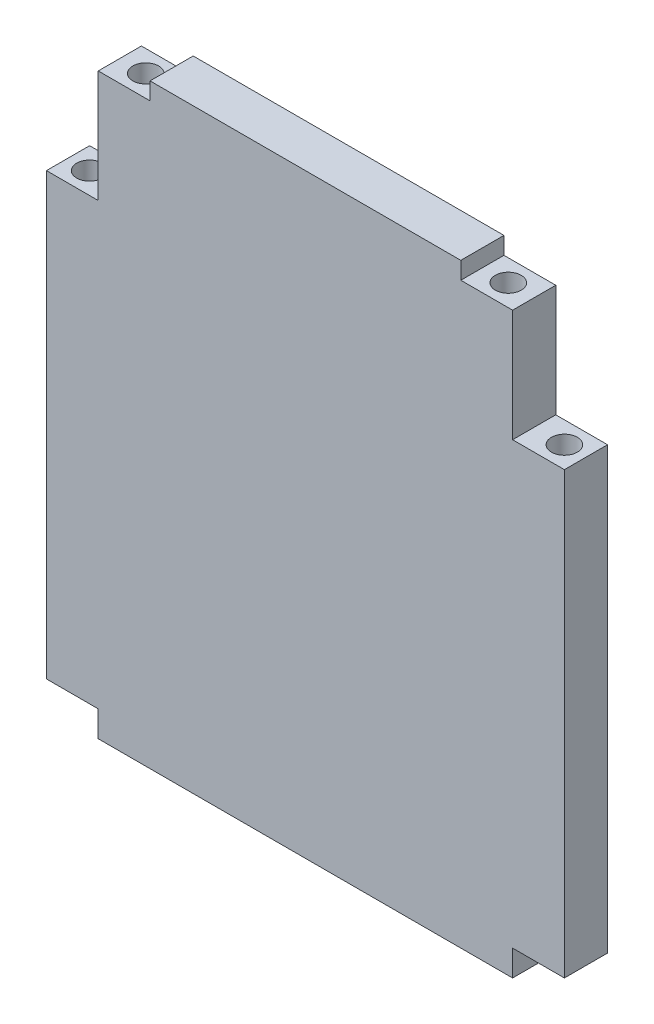
ISO-10303-21;
HEADER;
FILE_DESCRIPTION(('STEP AP214'),'2;1');
FILE_NAME('part.step','',(''),(''),'','','');
FILE_SCHEMA(('AUTOMOTIVE_DESIGN { 1 0 10303 214 1 1 1 1 }'));
ENDSEC;
DATA;
#1=APPLICATION_CONTEXT('core data for automotive mechanical design processes');
#2=APPLICATION_PROTOCOL_DEFINITION('international standard','automotive_design',2000,#1);
#3=PRODUCT_CONTEXT('',#1,'mechanical');
#4=PRODUCT('Part','Part','',(#3));
#5=PRODUCT_RELATED_PRODUCT_CATEGORY('part','',(#4));
#6=PRODUCT_DEFINITION_FORMATION('','',#4);
#7=PRODUCT_DEFINITION_CONTEXT('part definition',#1,'design');
#8=PRODUCT_DEFINITION('design','',#6,#7);
#9=PRODUCT_DEFINITION_SHAPE('','',#8);
#10=(LENGTH_UNIT() NAMED_UNIT(*) SI_UNIT(.MILLI.,.METRE.));
#11=(NAMED_UNIT(*) PLANE_ANGLE_UNIT() SI_UNIT($,.RADIAN.));
#12=(NAMED_UNIT(*) SI_UNIT($,.STERADIAN.) SOLID_ANGLE_UNIT());
#13=UNCERTAINTY_MEASURE_WITH_UNIT(LENGTH_MEASURE(1.E-05),#10,'distance_accuracy_value','');
#14=(GEOMETRIC_REPRESENTATION_CONTEXT(3) GLOBAL_UNCERTAINTY_ASSIGNED_CONTEXT((#13)) GLOBAL_UNIT_ASSIGNED_CONTEXT((#10,
#11,#12)) REPRESENTATION_CONTEXT('',''));
#15=CARTESIAN_POINT('',(0.,0.,0.));
#16=DIRECTION('',(0.,0.,1.));
#17=DIRECTION('',(1.,0.,0.));
#18=AXIS2_PLACEMENT_3D('',#15,#16,#17);
#19=CARTESIAN_POINT('',(-30.,25.5,5.));
#20=DIRECTION('',(0.,-1.,0.));
#21=DIRECTION('',(0.,0.,-1.));
#22=AXIS2_PLACEMENT_3D('',#19,#20,#21);
#23=PLANE('',#22);
#24=CARTESIAN_POINT('',(-27.5,25.5000000000001,2.5));
#25=DIRECTION('',(0.,1.,0.));
#26=DIRECTION('',(-1.,0.,0.));
#27=AXIS2_PLACEMENT_3D('',#24,#25,#26);
#28=CIRCLE('',#27,1.5);
#29=CARTESIAN_POINT('',(-29.,25.5000000000001,2.5));
#30=VERTEX_POINT('',#29);
#31=EDGE_CURVE('E314',#30,#30,#28,.T.);
#32=ORIENTED_EDGE('',*,*,#31,.F.);
#33=EDGE_LOOP('',(#32));
#34=FACE_BOUND('',#33,.T.);
#35=DIRECTION('',(-1.,0.,0.));
#36=VECTOR('',#35,1.);
#37=CARTESIAN_POINT('',(-30.,25.5,0.));
#38=LINE('',#37,#36);
#39=CARTESIAN_POINT('',(-24.,25.5,0.));
#40=VERTEX_POINT('',#39);
#41=CARTESIAN_POINT('',(-30.,25.5,0.));
#42=VERTEX_POINT('',#41);
#43=EDGE_CURVE('E177',#40,#42,#38,.T.);
#44=ORIENTED_EDGE('',*,*,#43,.T.);
#45=DIRECTION('',(0.,0.,-1.));
#46=VECTOR('',#45,1.);
#47=CARTESIAN_POINT('',(-30.,25.5,5.));
#48=LINE('',#47,#46);
#49=CARTESIAN_POINT('',(-30.,25.5,5.));
#50=VERTEX_POINT('',#49);
#51=EDGE_CURVE('E11',#50,#42,#48,.T.);
#52=ORIENTED_EDGE('',*,*,#51,.F.);
#53=DIRECTION('',(-1.,0.,0.));
#54=VECTOR('',#53,1.);
#55=CARTESIAN_POINT('',(-30.,25.5,5.));
#56=LINE('',#55,#54);
#57=CARTESIAN_POINT('',(-24.,25.5,5.));
#58=VERTEX_POINT('',#57);
#59=EDGE_CURVE('E208',#58,#50,#56,.T.);
#60=ORIENTED_EDGE('',*,*,#59,.F.);
#61=DIRECTION('',(0.,0.,-1.));
#62=VECTOR('',#61,1.);
#63=CARTESIAN_POINT('',(-24.,25.5,5.));
#64=LINE('',#63,#62);
#65=EDGE_CURVE('E173',#58,#40,#64,.T.);
#66=ORIENTED_EDGE('',*,*,#65,.T.);
#67=EDGE_LOOP('',(#44,#52,#60,#66));
#68=FACE_BOUND('',#67,.T.);
#69=ADVANCED_FACE('F33',(#34,#68),#23,.F.);
#70=CARTESIAN_POINT('',(-30.,-25.5,5.));
#71=DIRECTION('',(1.,0.,0.));
#72=DIRECTION('',(0.,0.,-1.));
#73=AXIS2_PLACEMENT_3D('',#70,#71,#72);
#74=PLANE('',#73);
#75=DIRECTION('',(0.,-1.,0.));
#76=VECTOR('',#75,1.);
#77=CARTESIAN_POINT('',(-30.,-25.5,0.));
#78=LINE('',#77,#76);
#79=CARTESIAN_POINT('',(-30.,-25.5,0.));
#80=VERTEX_POINT('',#79);
#81=EDGE_CURVE('E180',#42,#80,#78,.T.);
#82=ORIENTED_EDGE('',*,*,#81,.T.);
#83=DIRECTION('',(0.,0.,-1.));
#84=VECTOR('',#83,1.);
#85=CARTESIAN_POINT('',(-30.,-25.5,5.));
#86=LINE('',#85,#84);
#87=CARTESIAN_POINT('',(-30.,-25.5,5.));
#88=VERTEX_POINT('',#87);
#89=EDGE_CURVE('E41',#88,#80,#86,.T.);
#90=ORIENTED_EDGE('',*,*,#89,.F.);
#91=DIRECTION('',(0.,-1.,0.));
#92=VECTOR('',#91,1.);
#93=CARTESIAN_POINT('',(-30.,-25.5,5.));
#94=LINE('',#93,#92);
#95=EDGE_CURVE('E116',#50,#88,#94,.T.);
#96=ORIENTED_EDGE('',*,*,#95,.F.);
#97=ORIENTED_EDGE('',*,*,#51,.T.);
#98=EDGE_LOOP('',(#82,#90,#96,#97));
#99=FACE_BOUND('',#98,.T.);
#100=ADVANCED_FACE('F307',(#99),#74,.F.);
#101=CARTESIAN_POINT('',(-30.,-25.5,5.));
#102=DIRECTION('',(0.,1.,0.));
#103=DIRECTION('',(0.,0.,1.));
#104=AXIS2_PLACEMENT_3D('',#101,#102,#103);
#105=PLANE('',#104);
#106=CARTESIAN_POINT('',(-27.5,-25.5000000000001,2.5));
#107=DIRECTION('',(0.,1.,0.));
#108=DIRECTION('',(-1.,0.,0.));
#109=AXIS2_PLACEMENT_3D('',#106,#107,#108);
#110=CIRCLE('',#109,1.5);
#111=CARTESIAN_POINT('',(-29.,-25.5000000000001,2.5));
#112=VERTEX_POINT('',#111);
#113=EDGE_CURVE('E332',#112,#112,#110,.T.);
#114=ORIENTED_EDGE('',*,*,#113,.T.);
#115=EDGE_LOOP('',(#114));
#116=FACE_BOUND('',#115,.T.);
#117=DIRECTION('',(1.,0.,0.));
#118=VECTOR('',#117,1.);
#119=CARTESIAN_POINT('',(-30.,-25.5,0.));
#120=LINE('',#119,#118);
#121=CARTESIAN_POINT('',(-24.,-25.5,0.));
#122=VERTEX_POINT('',#121);
#123=EDGE_CURVE('E183',#80,#122,#120,.T.);
#124=ORIENTED_EDGE('',*,*,#123,.T.);
#125=DIRECTION('',(0.,0.,-1.));
#126=VECTOR('',#125,1.);
#127=CARTESIAN_POINT('',(-24.,-25.5,5.));
#128=LINE('',#127,#126);
#129=CARTESIAN_POINT('',(-24.,-25.5,5.));
#130=VERTEX_POINT('',#129);
#131=EDGE_CURVE('E239',#130,#122,#128,.T.);
#132=ORIENTED_EDGE('',*,*,#131,.F.);
#133=DIRECTION('',(1.,0.,0.));
#134=VECTOR('',#133,1.);
#135=CARTESIAN_POINT('',(-30.,-25.5,5.));
#136=LINE('',#135,#134);
#137=EDGE_CURVE('E247',#88,#130,#136,.T.);
#138=ORIENTED_EDGE('',*,*,#137,.F.);
#139=ORIENTED_EDGE('',*,*,#89,.T.);
#140=EDGE_LOOP('',(#124,#132,#138,#139));
#141=FACE_BOUND('',#140,.T.);
#142=ADVANCED_FACE('F245',(#116,#141),#105,.F.);
#143=CARTESIAN_POINT('',(-24.,-25.5,5.));
#144=DIRECTION('',(1.,0.,0.));
#145=DIRECTION('',(0.,0.,-1.));
#146=AXIS2_PLACEMENT_3D('',#143,#144,#145);
#147=PLANE('',#146);
#148=DIRECTION('',(0.,-1.,0.));
#149=VECTOR('',#148,1.);
#150=CARTESIAN_POINT('',(-24.,-25.5,0.));
#151=LINE('',#150,#149);
#152=CARTESIAN_POINT('',(-24.,-28.5,0.));
#153=VERTEX_POINT('',#152);
#154=EDGE_CURVE('E185',#122,#153,#151,.T.);
#155=ORIENTED_EDGE('',*,*,#154,.T.);
#156=DIRECTION('',(0.,0.,-1.));
#157=VECTOR('',#156,1.);
#158=CARTESIAN_POINT('',(-24.,-28.5,5.));
#159=LINE('',#158,#157);
#160=CARTESIAN_POINT('',(-24.,-28.5,5.));
#161=VERTEX_POINT('',#160);
#162=EDGE_CURVE('E236',#161,#153,#159,.T.);
#163=ORIENTED_EDGE('',*,*,#162,.F.);
#164=DIRECTION('',(0.,-1.,0.));
#165=VECTOR('',#164,1.);
#166=CARTESIAN_POINT('',(-24.,-25.5,5.));
#167=LINE('',#166,#165);
#168=EDGE_CURVE('E265',#130,#161,#167,.T.);
#169=ORIENTED_EDGE('',*,*,#168,.F.);
#170=ORIENTED_EDGE('',*,*,#131,.T.);
#171=EDGE_LOOP('',(#155,#163,#169,#170));
#172=FACE_BOUND('',#171,.T.);
#173=ADVANCED_FACE('F256',(#172),#147,.F.);
#174=CARTESIAN_POINT('',(-24.,-28.5,5.));
#175=DIRECTION('',(0.,1.,0.));
#176=DIRECTION('',(0.,0.,1.));
#177=AXIS2_PLACEMENT_3D('',#174,#175,#176);
#178=PLANE('',#177);
#179=DIRECTION('',(1.,0.,0.));
#180=VECTOR('',#179,1.);
#181=CARTESIAN_POINT('',(-24.,-28.5,0.));
#182=LINE('',#181,#180);
#183=CARTESIAN_POINT('',(24.,-28.5,0.));
#184=VERTEX_POINT('',#183);
#185=EDGE_CURVE('E187',#153,#184,#182,.T.);
#186=ORIENTED_EDGE('',*,*,#185,.T.);
#187=DIRECTION('',(0.,0.,-1.));
#188=VECTOR('',#187,1.);
#189=CARTESIAN_POINT('',(24.,-28.5,5.));
#190=LINE('',#189,#188);
#191=CARTESIAN_POINT('',(24.,-28.5,5.));
#192=VERTEX_POINT('',#191);
#193=EDGE_CURVE('E233',#192,#184,#190,.T.);
#194=ORIENTED_EDGE('',*,*,#193,.F.);
#195=DIRECTION('',(1.,0.,0.));
#196=VECTOR('',#195,1.);
#197=CARTESIAN_POINT('',(-24.,-28.5,5.));
#198=LINE('',#197,#196);
#199=EDGE_CURVE('E262',#161,#192,#198,.T.);
#200=ORIENTED_EDGE('',*,*,#199,.F.);
#201=ORIENTED_EDGE('',*,*,#162,.T.);
#202=EDGE_LOOP('',(#186,#194,#200,#201));
#203=FACE_BOUND('',#202,.T.);
#204=ADVANCED_FACE('F260',(#203),#178,.F.);
#205=CARTESIAN_POINT('',(24.,-28.5,5.));
#206=DIRECTION('',(-1.,0.,0.));
#207=DIRECTION('',(0.,-1.,0.));
#208=AXIS2_PLACEMENT_3D('',#205,#206,#207);
#209=PLANE('',#208);
#210=DIRECTION('',(0.,1.,0.));
#211=VECTOR('',#210,1.);
#212=CARTESIAN_POINT('',(24.,-28.5,0.));
#213=LINE('',#212,#211);
#214=CARTESIAN_POINT('',(24.,-25.5,0.));
#215=VERTEX_POINT('',#214);
#216=EDGE_CURVE('E189',#184,#215,#213,.T.);
#217=ORIENTED_EDGE('',*,*,#216,.T.);
#218=DIRECTION('',(0.,0.,-1.));
#219=VECTOR('',#218,1.);
#220=CARTESIAN_POINT('',(24.,-25.5,5.));
#221=LINE('',#220,#219);
#222=CARTESIAN_POINT('',(24.,-25.5,5.));
#223=VERTEX_POINT('',#222);
#224=EDGE_CURVE('E230',#223,#215,#221,.T.);
#225=ORIENTED_EDGE('',*,*,#224,.F.);
#226=DIRECTION('',(0.,1.,0.));
#227=VECTOR('',#226,1.);
#228=CARTESIAN_POINT('',(24.,-28.5,5.));
#229=LINE('',#228,#227);
#230=EDGE_CURVE('E264',#192,#223,#229,.T.);
#231=ORIENTED_EDGE('',*,*,#230,.F.);
#232=ORIENTED_EDGE('',*,*,#193,.T.);
#233=EDGE_LOOP('',(#217,#225,#231,#232));
#234=FACE_BOUND('',#233,.T.);
#235=ADVANCED_FACE('F392',(#234),#209,.F.);
#236=CARTESIAN_POINT('',(24.,-25.5,5.));
#237=DIRECTION('',(0.,1.,0.));
#238=DIRECTION('',(0.,0.,1.));
#239=AXIS2_PLACEMENT_3D('',#236,#237,#238);
#240=PLANE('',#239);
#241=CARTESIAN_POINT('',(27.5,-25.4999999999999,2.49999999999999));
#242=DIRECTION('',(0.,1.,0.));
#243=DIRECTION('',(1.,0.,0.));
#244=AXIS2_PLACEMENT_3D('',#241,#242,#243);
#245=CIRCLE('',#244,1.49999999999962);
#246=CARTESIAN_POINT('',(28.9999999999996,-25.4999999999999,2.49999999999999));
#247=VERTEX_POINT('',#246);
#248=EDGE_CURVE('E344',#247,#247,#245,.T.);
#249=ORIENTED_EDGE('',*,*,#248,.T.);
#250=EDGE_LOOP('',(#249));
#251=FACE_BOUND('',#250,.T.);
#252=DIRECTION('',(1.,0.,0.));
#253=VECTOR('',#252,1.);
#254=CARTESIAN_POINT('',(24.,-25.5,0.));
#255=LINE('',#254,#253);
#256=CARTESIAN_POINT('',(30.,-25.5,0.));
#257=VERTEX_POINT('',#256);
#258=EDGE_CURVE('E191',#215,#257,#255,.T.);
#259=ORIENTED_EDGE('',*,*,#258,.T.);
#260=DIRECTION('',(0.,0.,-1.));
#261=VECTOR('',#260,1.);
#262=CARTESIAN_POINT('',(30.,-25.5,5.));
#263=LINE('',#262,#261);
#264=CARTESIAN_POINT('',(30.,-25.5,5.));
#265=VERTEX_POINT('',#264);
#266=EDGE_CURVE('E227',#265,#257,#263,.T.);
#267=ORIENTED_EDGE('',*,*,#266,.F.);
#268=DIRECTION('',(1.,0.,0.));
#269=VECTOR('',#268,1.);
#270=CARTESIAN_POINT('',(24.,-25.5,5.));
#271=LINE('',#270,#269);
#272=EDGE_CURVE('E267',#223,#265,#271,.T.);
#273=ORIENTED_EDGE('',*,*,#272,.F.);
#274=ORIENTED_EDGE('',*,*,#224,.T.);
#275=EDGE_LOOP('',(#259,#267,#273,#274));
#276=FACE_BOUND('',#275,.T.);
#277=ADVANCED_FACE('F388',(#251,#276),#240,.F.);
#278=CARTESIAN_POINT('',(30.,-25.5,5.));
#279=DIRECTION('',(-1.,0.,0.));
#280=DIRECTION('',(0.,0.,1.));
#281=AXIS2_PLACEMENT_3D('',#278,#279,#280);
#282=PLANE('',#281);
#283=DIRECTION('',(0.,1.,0.));
#284=VECTOR('',#283,1.);
#285=CARTESIAN_POINT('',(30.,-25.5,0.));
#286=LINE('',#285,#284);
#287=CARTESIAN_POINT('',(30.,25.5,0.));
#288=VERTEX_POINT('',#287);
#289=EDGE_CURVE('E193',#257,#288,#286,.T.);
#290=ORIENTED_EDGE('',*,*,#289,.T.);
#291=DIRECTION('',(0.,0.,-1.));
#292=VECTOR('',#291,1.);
#293=CARTESIAN_POINT('',(30.,25.5,5.));
#294=LINE('',#293,#292);
#295=CARTESIAN_POINT('',(30.,25.5,5.));
#296=VERTEX_POINT('',#295);
#297=EDGE_CURVE('E224',#296,#288,#294,.T.);
#298=ORIENTED_EDGE('',*,*,#297,.F.);
#299=DIRECTION('',(0.,1.,0.));
#300=VECTOR('',#299,1.);
#301=CARTESIAN_POINT('',(30.,-25.5,5.));
#302=LINE('',#301,#300);
#303=EDGE_CURVE('E273',#265,#296,#302,.T.);
#304=ORIENTED_EDGE('',*,*,#303,.F.);
#305=ORIENTED_EDGE('',*,*,#266,.T.);
#306=EDGE_LOOP('',(#290,#298,#304,#305));
#307=FACE_BOUND('',#306,.T.);
#308=ADVANCED_FACE('F384',(#307),#282,.F.);
#309=CARTESIAN_POINT('',(24.,25.5,5.));
#310=DIRECTION('',(0.,-1.,0.));
#311=DIRECTION('',(0.,0.,-1.));
#312=AXIS2_PLACEMENT_3D('',#309,#310,#311);
#313=PLANE('',#312);
#314=CARTESIAN_POINT('',(27.5,25.4999999999999,2.49999999999999));
#315=DIRECTION('',(0.,1.,0.));
#316=DIRECTION('',(1.,0.,0.));
#317=AXIS2_PLACEMENT_3D('',#314,#315,#316);
#318=CIRCLE('',#317,1.49999999999962);
#319=CARTESIAN_POINT('',(28.9999999999996,25.4999999999999,2.49999999999999));
#320=VERTEX_POINT('',#319);
#321=EDGE_CURVE('E321',#320,#320,#318,.T.);
#322=ORIENTED_EDGE('',*,*,#321,.F.);
#323=EDGE_LOOP('',(#322));
#324=FACE_BOUND('',#323,.T.);
#325=DIRECTION('',(-1.,0.,0.));
#326=VECTOR('',#325,1.);
#327=CARTESIAN_POINT('',(24.,25.5,0.));
#328=LINE('',#327,#326);
#329=CARTESIAN_POINT('',(24.,25.5,0.));
#330=VERTEX_POINT('',#329);
#331=EDGE_CURVE('E195',#288,#330,#328,.T.);
#332=ORIENTED_EDGE('',*,*,#331,.T.);
#333=DIRECTION('',(0.,0.,-1.));
#334=VECTOR('',#333,1.);
#335=CARTESIAN_POINT('',(24.,25.5,5.));
#336=LINE('',#335,#334);
#337=CARTESIAN_POINT('',(24.,25.5,5.));
#338=VERTEX_POINT('',#337);
#339=EDGE_CURVE('E221',#338,#330,#336,.T.);
#340=ORIENTED_EDGE('',*,*,#339,.F.);
#341=DIRECTION('',(-1.,0.,0.));
#342=VECTOR('',#341,1.);
#343=CARTESIAN_POINT('',(24.,25.5,5.));
#344=LINE('',#343,#342);
#345=EDGE_CURVE('E275',#296,#338,#344,.T.);
#346=ORIENTED_EDGE('',*,*,#345,.F.);
#347=ORIENTED_EDGE('',*,*,#297,.T.);
#348=EDGE_LOOP('',(#332,#340,#346,#347));
#349=FACE_BOUND('',#348,.T.);
#350=ADVANCED_FACE('F380',(#324,#349),#313,.F.);
#351=CARTESIAN_POINT('',(24.,38.5,5.));
#352=DIRECTION('',(-1.,0.,0.));
#353=DIRECTION('',(0.,0.,1.));
#354=AXIS2_PLACEMENT_3D('',#351,#352,#353);
#355=PLANE('',#354);
#356=DIRECTION('',(0.,1.,0.));
#357=VECTOR('',#356,1.);
#358=CARTESIAN_POINT('',(24.,38.5,0.));
#359=LINE('',#358,#357);
#360=CARTESIAN_POINT('',(24.,38.5,0.));
#361=VERTEX_POINT('',#360);
#362=EDGE_CURVE('E197',#330,#361,#359,.T.);
#363=ORIENTED_EDGE('',*,*,#362,.T.);
#364=DIRECTION('',(0.,0.,-1.));
#365=VECTOR('',#364,1.);
#366=CARTESIAN_POINT('',(24.,38.5,5.));
#367=LINE('',#366,#365);
#368=CARTESIAN_POINT('',(24.,38.5,5.));
#369=VERTEX_POINT('',#368);
#370=EDGE_CURVE('E218',#369,#361,#367,.T.);
#371=ORIENTED_EDGE('',*,*,#370,.F.);
#372=DIRECTION('',(0.,1.,0.));
#373=VECTOR('',#372,1.);
#374=CARTESIAN_POINT('',(24.,38.5,5.));
#375=LINE('',#374,#373);
#376=EDGE_CURVE('E277',#338,#369,#375,.T.);
#377=ORIENTED_EDGE('',*,*,#376,.F.);
#378=ORIENTED_EDGE('',*,*,#339,.T.);
#379=EDGE_LOOP('',(#363,#371,#377,#378));
#380=FACE_BOUND('',#379,.T.);
#381=ADVANCED_FACE('F368',(#380),#355,.F.);
#382=CARTESIAN_POINT('',(18.,38.5,5.));
#383=DIRECTION('',(0.,-1.,0.));
#384=DIRECTION('',(0.,0.,-1.));
#385=AXIS2_PLACEMENT_3D('',#382,#383,#384);
#386=PLANE('',#385);
#387=CARTESIAN_POINT('',(21.,38.5,2.5));
#388=DIRECTION('',(0.,1.,0.));
#389=DIRECTION('',(0.,0.,-1.));
#390=AXIS2_PLACEMENT_3D('',#387,#388,#389);
#391=CIRCLE('',#390,1.5);
#392=CARTESIAN_POINT('',(21.,38.5,0.999999999999995));
#393=VERTEX_POINT('',#392);
#394=EDGE_CURVE('E340',#393,#393,#391,.T.);
#395=ORIENTED_EDGE('',*,*,#394,.F.);
#396=EDGE_LOOP('',(#395));
#397=FACE_BOUND('',#396,.T.);
#398=DIRECTION('',(-1.,0.,0.));
#399=VECTOR('',#398,1.);
#400=CARTESIAN_POINT('',(18.,38.5,0.));
#401=LINE('',#400,#399);
#402=CARTESIAN_POINT('',(18.,38.5,0.));
#403=VERTEX_POINT('',#402);
#404=EDGE_CURVE('E199',#361,#403,#401,.T.);
#405=ORIENTED_EDGE('',*,*,#404,.T.);
#406=DIRECTION('',(0.,0.,-1.));
#407=VECTOR('',#406,1.);
#408=CARTESIAN_POINT('',(18.,38.5,5.));
#409=LINE('',#408,#407);
#410=CARTESIAN_POINT('',(18.,38.5,5.));
#411=VERTEX_POINT('',#410);
#412=EDGE_CURVE('E215',#411,#403,#409,.T.);
#413=ORIENTED_EDGE('',*,*,#412,.F.);
#414=DIRECTION('',(-1.,0.,0.));
#415=VECTOR('',#414,1.);
#416=CARTESIAN_POINT('',(18.,38.5,5.));
#417=LINE('',#416,#415);
#418=EDGE_CURVE('E279',#369,#411,#417,.T.);
#419=ORIENTED_EDGE('',*,*,#418,.F.);
#420=ORIENTED_EDGE('',*,*,#370,.T.);
#421=EDGE_LOOP('',(#405,#413,#419,#420));
#422=FACE_BOUND('',#421,.T.);
#423=ADVANCED_FACE('F365',(#397,#422),#386,.F.);
#424=CARTESIAN_POINT('',(17.9999999999999,40.5,5.));
#425=DIRECTION('',(-1.,0.,0.));
#426=DIRECTION('',(0.,-1.,0.));
#427=AXIS2_PLACEMENT_3D('',#424,#425,#426);
#428=PLANE('',#427);
#429=DIRECTION('',(0.,1.,0.));
#430=VECTOR('',#429,1.);
#431=CARTESIAN_POINT('',(17.9999999999999,40.5,0.));
#432=LINE('',#431,#430);
#433=CARTESIAN_POINT('',(17.9999999999999,40.5,0.));
#434=VERTEX_POINT('',#433);
#435=EDGE_CURVE('E201',#403,#434,#432,.T.);
#436=ORIENTED_EDGE('',*,*,#435,.T.);
#437=DIRECTION('',(0.,0.,-1.));
#438=VECTOR('',#437,1.);
#439=CARTESIAN_POINT('',(17.9999999999999,40.5,5.));
#440=LINE('',#439,#438);
#441=CARTESIAN_POINT('',(17.9999999999999,40.5,5.));
#442=VERTEX_POINT('',#441);
#443=EDGE_CURVE('E212',#442,#434,#440,.T.);
#444=ORIENTED_EDGE('',*,*,#443,.F.);
#445=DIRECTION('',(0.,1.,0.));
#446=VECTOR('',#445,1.);
#447=CARTESIAN_POINT('',(17.9999999999999,40.5,5.));
#448=LINE('',#447,#446);
#449=EDGE_CURVE('E281',#411,#442,#448,.T.);
#450=ORIENTED_EDGE('',*,*,#449,.F.);
#451=ORIENTED_EDGE('',*,*,#412,.T.);
#452=EDGE_LOOP('',(#436,#444,#450,#451));
#453=FACE_BOUND('',#452,.T.);
#454=ADVANCED_FACE('F287',(#453),#428,.F.);
#455=CARTESIAN_POINT('',(-18.,40.5,5.));
#456=DIRECTION('',(0.,-1.,0.));
#457=DIRECTION('',(0.,0.,-1.));
#458=AXIS2_PLACEMENT_3D('',#455,#456,#457);
#459=PLANE('',#458);
#460=DIRECTION('',(-1.,0.,0.));
#461=VECTOR('',#460,1.);
#462=CARTESIAN_POINT('',(-18.,40.5,0.));
#463=LINE('',#462,#461);
#464=CARTESIAN_POINT('',(-18.,40.5,0.));
#465=VERTEX_POINT('',#464);
#466=EDGE_CURVE('E203',#434,#465,#463,.T.);
#467=ORIENTED_EDGE('',*,*,#466,.T.);
#468=DIRECTION('',(0.,0.,-1.));
#469=VECTOR('',#468,1.);
#470=CARTESIAN_POINT('',(-18.,40.5,5.));
#471=LINE('',#470,#469);
#472=CARTESIAN_POINT('',(-18.,40.5,5.));
#473=VERTEX_POINT('',#472);
#474=EDGE_CURVE('E168',#473,#465,#471,.T.);
#475=ORIENTED_EDGE('',*,*,#474,.F.);
#476=DIRECTION('',(-1.,0.,0.));
#477=VECTOR('',#476,1.);
#478=CARTESIAN_POINT('',(-18.,40.5,5.));
#479=LINE('',#478,#477);
#480=EDGE_CURVE('E159',#442,#473,#479,.T.);
#481=ORIENTED_EDGE('',*,*,#480,.F.);
#482=ORIENTED_EDGE('',*,*,#443,.T.);
#483=EDGE_LOOP('',(#467,#475,#481,#482));
#484=FACE_BOUND('',#483,.T.);
#485=ADVANCED_FACE('F291',(#484),#459,.F.);
#486=CARTESIAN_POINT('',(-18.,38.5,5.));
#487=DIRECTION('',(1.,0.,0.));
#488=DIRECTION('',(0.,0.,-1.));
#489=AXIS2_PLACEMENT_3D('',#486,#487,#488);
#490=PLANE('',#489);
#491=DIRECTION('',(0.,-1.,0.));
#492=VECTOR('',#491,1.);
#493=CARTESIAN_POINT('',(-18.,38.5,0.));
#494=LINE('',#493,#492);
#495=CARTESIAN_POINT('',(-18.,38.5,0.));
#496=VERTEX_POINT('',#495);
#497=EDGE_CURVE('E167',#465,#496,#494,.T.);
#498=ORIENTED_EDGE('',*,*,#497,.T.);
#499=DIRECTION('',(0.,0.,-1.));
#500=VECTOR('',#499,1.);
#501=CARTESIAN_POINT('',(-18.,38.5,5.));
#502=LINE('',#501,#500);
#503=CARTESIAN_POINT('',(-18.,38.5,5.));
#504=VERTEX_POINT('',#503);
#505=EDGE_CURVE('E164',#504,#496,#502,.T.);
#506=ORIENTED_EDGE('',*,*,#505,.F.);
#507=DIRECTION('',(0.,-1.,0.));
#508=VECTOR('',#507,1.);
#509=CARTESIAN_POINT('',(-18.,38.5,5.));
#510=LINE('',#509,#508);
#511=EDGE_CURVE('E153',#473,#504,#510,.T.);
#512=ORIENTED_EDGE('',*,*,#511,.F.);
#513=ORIENTED_EDGE('',*,*,#474,.T.);
#514=EDGE_LOOP('',(#498,#506,#512,#513));
#515=FACE_BOUND('',#514,.T.);
#516=ADVANCED_FACE('F165',(#515),#490,.F.);
#517=CARTESIAN_POINT('',(-24.,38.5,5.));
#518=DIRECTION('',(0.,-1.,0.));
#519=DIRECTION('',(0.,0.,-1.));
#520=AXIS2_PLACEMENT_3D('',#517,#518,#519);
#521=PLANE('',#520);
#522=CARTESIAN_POINT('',(-21.,38.5,2.5));
#523=DIRECTION('',(0.,1.,0.));
#524=DIRECTION('',(0.,0.,1.));
#525=AXIS2_PLACEMENT_3D('',#522,#523,#524);
#526=CIRCLE('',#525,1.5);
#527=CARTESIAN_POINT('',(-21.,38.5,4.));
#528=VERTEX_POINT('',#527);
#529=EDGE_CURVE('E350',#528,#528,#526,.T.);
#530=ORIENTED_EDGE('',*,*,#529,.F.);
#531=EDGE_LOOP('',(#530));
#532=FACE_BOUND('',#531,.T.);
#533=DIRECTION('',(-1.,0.,0.));
#534=VECTOR('',#533,1.);
#535=CARTESIAN_POINT('',(-24.,38.5,0.));
#536=LINE('',#535,#534);
#537=CARTESIAN_POINT('',(-24.,38.5,0.));
#538=VERTEX_POINT('',#537);
#539=EDGE_CURVE('E102',#496,#538,#536,.T.);
#540=ORIENTED_EDGE('',*,*,#539,.T.);
#541=DIRECTION('',(0.,0.,-1.));
#542=VECTOR('',#541,1.);
#543=CARTESIAN_POINT('',(-24.,38.5,5.));
#544=LINE('',#543,#542);
#545=CARTESIAN_POINT('',(-24.,38.5,5.));
#546=VERTEX_POINT('',#545);
#547=EDGE_CURVE('E169',#546,#538,#544,.T.);
#548=ORIENTED_EDGE('',*,*,#547,.F.);
#549=DIRECTION('',(-1.,0.,0.));
#550=VECTOR('',#549,1.);
#551=CARTESIAN_POINT('',(-24.,38.5,5.));
#552=LINE('',#551,#550);
#553=EDGE_CURVE('E157',#504,#546,#552,.T.);
#554=ORIENTED_EDGE('',*,*,#553,.F.);
#555=ORIENTED_EDGE('',*,*,#505,.T.);
#556=EDGE_LOOP('',(#540,#548,#554,#555));
#557=FACE_BOUND('',#556,.T.);
#558=ADVANCED_FACE('F171',(#532,#557),#521,.F.);
#559=CARTESIAN_POINT('',(-24.,25.5,5.));
#560=DIRECTION('',(1.,0.,0.));
#561=DIRECTION('',(0.,1.,0.));
#562=AXIS2_PLACEMENT_3D('',#559,#560,#561);
#563=PLANE('',#562);
#564=DIRECTION('',(0.,-1.,0.));
#565=VECTOR('',#564,1.);
#566=CARTESIAN_POINT('',(-24.,25.5,0.));
#567=LINE('',#566,#565);
#568=EDGE_CURVE('E108',#538,#40,#567,.T.);
#569=ORIENTED_EDGE('',*,*,#568,.T.);
#570=ORIENTED_EDGE('',*,*,#65,.F.);
#571=DIRECTION('',(0.,-1.,0.));
#572=VECTOR('',#571,1.);
#573=CARTESIAN_POINT('',(-24.,25.5,5.));
#574=LINE('',#573,#572);
#575=EDGE_CURVE('E49',#546,#58,#574,.T.);
#576=ORIENTED_EDGE('',*,*,#575,.F.);
#577=ORIENTED_EDGE('',*,*,#547,.T.);
#578=EDGE_LOOP('',(#569,#570,#576,#577));
#579=FACE_BOUND('',#578,.T.);
#580=ADVANCED_FACE('F295',(#579),#563,.F.);
#581=CARTESIAN_POINT('',(0.,0.,5.));
#582=DIRECTION('',(0.,0.,1.));
#583=DIRECTION('',(1.,0.,0.));
#584=AXIS2_PLACEMENT_3D('',#581,#582,#583);
#585=PLANE('',#584);
#586=ORIENTED_EDGE('',*,*,#59,.T.);
#587=ORIENTED_EDGE('',*,*,#95,.T.);
#588=ORIENTED_EDGE('',*,*,#137,.T.);
#589=ORIENTED_EDGE('',*,*,#168,.T.);
#590=ORIENTED_EDGE('',*,*,#199,.T.);
#591=ORIENTED_EDGE('',*,*,#230,.T.);
#592=ORIENTED_EDGE('',*,*,#272,.T.);
#593=ORIENTED_EDGE('',*,*,#303,.T.);
#594=ORIENTED_EDGE('',*,*,#345,.T.);
#595=ORIENTED_EDGE('',*,*,#376,.T.);
#596=ORIENTED_EDGE('',*,*,#418,.T.);
#597=ORIENTED_EDGE('',*,*,#449,.T.);
#598=ORIENTED_EDGE('',*,*,#480,.T.);
#599=ORIENTED_EDGE('',*,*,#511,.T.);
#600=ORIENTED_EDGE('',*,*,#553,.T.);
#601=ORIENTED_EDGE('',*,*,#575,.T.);
#602=EDGE_LOOP('',(#586,#587,#588,#589,#590,#591,#592,#593,#594,#595,#596,#597,#598,#599,#600,#601));
#603=FACE_BOUND('',#602,.T.);
#604=ADVANCED_FACE('F155',(#603),#585,.T.);
#605=CARTESIAN_POINT('',(0.,0.,0.));
#606=DIRECTION('',(0.,0.,1.));
#607=DIRECTION('',(1.,0.,0.));
#608=AXIS2_PLACEMENT_3D('',#605,#606,#607);
#609=PLANE('',#608);
#610=ORIENTED_EDGE('',*,*,#43,.F.);
#611=ORIENTED_EDGE('',*,*,#568,.F.);
#612=ORIENTED_EDGE('',*,*,#539,.F.);
#613=ORIENTED_EDGE('',*,*,#497,.F.);
#614=ORIENTED_EDGE('',*,*,#466,.F.);
#615=ORIENTED_EDGE('',*,*,#435,.F.);
#616=ORIENTED_EDGE('',*,*,#404,.F.);
#617=ORIENTED_EDGE('',*,*,#362,.F.);
#618=ORIENTED_EDGE('',*,*,#331,.F.);
#619=ORIENTED_EDGE('',*,*,#289,.F.);
#620=ORIENTED_EDGE('',*,*,#258,.F.);
#621=ORIENTED_EDGE('',*,*,#216,.F.);
#622=ORIENTED_EDGE('',*,*,#185,.F.);
#623=ORIENTED_EDGE('',*,*,#154,.F.);
#624=ORIENTED_EDGE('',*,*,#123,.F.);
#625=ORIENTED_EDGE('',*,*,#81,.F.);
#626=EDGE_LOOP('',(#610,#611,#612,#613,#614,#615,#616,#617,#618,#619,#620,#621,#622,#623,#624,#625));
#627=FACE_BOUND('',#626,.T.);
#628=ADVANCED_FACE('F251',(#627),#609,.F.);
#629=CARTESIAN_POINT('',(27.4999999999999,15.4999999999999,2.49999999999999));
#630=DIRECTION('',(0.,1.,0.));
#631=DIRECTION('',(-1.,0.,0.));
#632=AXIS2_PLACEMENT_3D('',#629,#630,#631);
#633=CYLINDRICAL_SURFACE('',#632,1.49999999999962);
#634=CARTESIAN_POINT('',(27.4999999999999,15.4999999999999,2.49999999999999));
#635=DIRECTION('',(0.,1.,0.));
#636=DIRECTION('',(1.,0.,0.));
#637=AXIS2_PLACEMENT_3D('',#634,#635,#636);
#638=CIRCLE('',#637,1.49999999999962);
#639=CARTESIAN_POINT('',(28.9999999999995,15.4999999999999,2.49999999999999));
#640=VERTEX_POINT('',#639);
#641=EDGE_CURVE('E316',#640,#640,#638,.T.);
#642=ORIENTED_EDGE('',*,*,#641,.F.);
#643=EDGE_LOOP('',(#642));
#644=FACE_BOUND('',#643,.T.);
#645=ORIENTED_EDGE('',*,*,#321,.T.);
#646=EDGE_LOOP('',(#645));
#647=FACE_BOUND('',#646,.T.);
#648=ADVANCED_FACE('F442',(#644,#647),#633,.F.);
#649=CARTESIAN_POINT('',(27.4999999999999,15.4999999999999,2.49999999999999));
#650=DIRECTION('',(0.,-1.,0.));
#651=DIRECTION('',(1.,0.,0.));
#652=AXIS2_PLACEMENT_3D('',#649,#650,#651);
#653=PLANE('',#652);
#654=ORIENTED_EDGE('',*,*,#641,.T.);
#655=EDGE_LOOP('',(#654));
#656=FACE_BOUND('',#655,.T.);
#657=ADVANCED_FACE('F438',(#656),#653,.F.);
#658=CARTESIAN_POINT('',(-27.5,15.5000000000001,2.5));
#659=DIRECTION('',(0.,1.,0.));
#660=DIRECTION('',(-1.,0.,0.));
#661=AXIS2_PLACEMENT_3D('',#658,#659,#660);
#662=CYLINDRICAL_SURFACE('',#661,1.5);
#663=CARTESIAN_POINT('',(-27.5,15.5000000000001,2.5));
#664=DIRECTION('',(0.,1.,0.));
#665=DIRECTION('',(-1.,0.,0.));
#666=AXIS2_PLACEMENT_3D('',#663,#664,#665);
#667=CIRCLE('',#666,1.5);
#668=CARTESIAN_POINT('',(-29.,15.5000000000001,2.5));
#669=VERTEX_POINT('',#668);
#670=EDGE_CURVE('E181',#669,#669,#667,.T.);
#671=ORIENTED_EDGE('',*,*,#670,.F.);
#672=EDGE_LOOP('',(#671));
#673=FACE_BOUND('',#672,.T.);
#674=ORIENTED_EDGE('',*,*,#31,.T.);
#675=EDGE_LOOP('',(#674));
#676=FACE_BOUND('',#675,.T.);
#677=ADVANCED_FACE('F434',(#673,#676),#662,.F.);
#678=CARTESIAN_POINT('',(-27.5,15.5000000000001,2.5));
#679=DIRECTION('',(0.,1.,0.));
#680=DIRECTION('',(-1.,0.,0.));
#681=AXIS2_PLACEMENT_3D('',#678,#679,#680);
#682=PLANE('',#681);
#683=ORIENTED_EDGE('',*,*,#670,.T.);
#684=EDGE_LOOP('',(#683));
#685=FACE_BOUND('',#684,.T.);
#686=ADVANCED_FACE('F430',(#685),#682,.T.);
#687=CARTESIAN_POINT('',(27.4999999999999,-15.4999999999999,2.49999999999999));
#688=DIRECTION('',(0.,-1.,0.));
#689=DIRECTION('',(1.,0.,0.));
#690=AXIS2_PLACEMENT_3D('',#687,#688,#689);
#691=CYLINDRICAL_SURFACE('',#690,1.49999999999962);
#692=CARTESIAN_POINT('',(27.4999999999999,-15.4999999999999,2.49999999999999));
#693=DIRECTION('',(0.,1.,0.));
#694=DIRECTION('',(1.,0.,0.));
#695=AXIS2_PLACEMENT_3D('',#692,#693,#694);
#696=CIRCLE('',#695,1.49999999999962);
#697=CARTESIAN_POINT('',(28.9999999999995,-15.4999999999999,2.49999999999999));
#698=VERTEX_POINT('',#697);
#699=EDGE_CURVE('E337',#698,#698,#696,.T.);
#700=ORIENTED_EDGE('',*,*,#699,.T.);
#701=EDGE_LOOP('',(#700));
#702=FACE_BOUND('',#701,.T.);
#703=ORIENTED_EDGE('',*,*,#248,.F.);
#704=EDGE_LOOP('',(#703));
#705=FACE_BOUND('',#704,.T.);
#706=ADVANCED_FACE('F423',(#702,#705),#691,.F.);
#707=CARTESIAN_POINT('',(27.4999999999999,-15.4999999999999,2.49999999999999));
#708=DIRECTION('',(0.,1.,0.));
#709=DIRECTION('',(1.,0.,0.));
#710=AXIS2_PLACEMENT_3D('',#707,#708,#709);
#711=PLANE('',#710);
#712=ORIENTED_EDGE('',*,*,#699,.F.);
#713=EDGE_LOOP('',(#712));
#714=FACE_BOUND('',#713,.T.);
#715=ADVANCED_FACE('F414',(#714),#711,.F.);
#716=CARTESIAN_POINT('',(-27.5,-15.5000000000001,2.5));
#717=DIRECTION('',(0.,-1.,0.));
#718=DIRECTION('',(1.,0.,0.));
#719=AXIS2_PLACEMENT_3D('',#716,#717,#718);
#720=CYLINDRICAL_SURFACE('',#719,1.5);
#721=CARTESIAN_POINT('',(-27.5,-15.5000000000001,2.5));
#722=DIRECTION('',(0.,1.,0.));
#723=DIRECTION('',(-1.,0.,0.));
#724=AXIS2_PLACEMENT_3D('',#721,#722,#723);
#725=CIRCLE('',#724,1.5);
#726=CARTESIAN_POINT('',(-29.,-15.5000000000001,2.5));
#727=VERTEX_POINT('',#726);
#728=EDGE_CURVE('E327',#727,#727,#725,.T.);
#729=ORIENTED_EDGE('',*,*,#728,.T.);
#730=EDGE_LOOP('',(#729));
#731=FACE_BOUND('',#730,.T.);
#732=ORIENTED_EDGE('',*,*,#113,.F.);
#733=EDGE_LOOP('',(#732));
#734=FACE_BOUND('',#733,.T.);
#735=ADVANCED_FACE('F411',(#731,#734),#720,.F.);
#736=CARTESIAN_POINT('',(-27.5,-15.5000000000001,2.5));
#737=DIRECTION('',(0.,-1.,0.));
#738=DIRECTION('',(-1.,0.,0.));
#739=AXIS2_PLACEMENT_3D('',#736,#737,#738);
#740=PLANE('',#739);
#741=ORIENTED_EDGE('',*,*,#728,.F.);
#742=EDGE_LOOP('',(#741));
#743=FACE_BOUND('',#742,.T.);
#744=ADVANCED_FACE('F413',(#743),#740,.T.);
#745=CARTESIAN_POINT('',(-21.,28.5,2.5));
#746=DIRECTION('',(0.,1.,0.));
#747=DIRECTION('',(0.,0.,1.));
#748=AXIS2_PLACEMENT_3D('',#745,#746,#747);
#749=CYLINDRICAL_SURFACE('',#748,1.5);
#750=CARTESIAN_POINT('',(-21.,28.5,2.5));
#751=DIRECTION('',(0.,1.,0.));
#752=DIRECTION('',(0.,0.,1.));
#753=AXIS2_PLACEMENT_3D('',#750,#751,#752);
#754=CIRCLE('',#753,1.5);
#755=CARTESIAN_POINT('',(-21.,28.5,4.));
#756=VERTEX_POINT('',#755);
#757=EDGE_CURVE('E346',#756,#756,#754,.T.);
#758=ORIENTED_EDGE('',*,*,#757,.F.);
#759=EDGE_LOOP('',(#758));
#760=FACE_BOUND('',#759,.T.);
#761=ORIENTED_EDGE('',*,*,#529,.T.);
#762=EDGE_LOOP('',(#761));
#763=FACE_BOUND('',#762,.T.);
#764=ADVANCED_FACE('F420',(#760,#763),#749,.F.);
#765=CARTESIAN_POINT('',(-21.,28.5,2.5));
#766=DIRECTION('',(0.,1.,0.));
#767=DIRECTION('',(0.,0.,1.));
#768=AXIS2_PLACEMENT_3D('',#765,#766,#767);
#769=PLANE('',#768);
#770=ORIENTED_EDGE('',*,*,#757,.T.);
#771=EDGE_LOOP('',(#770));
#772=FACE_BOUND('',#771,.T.);
#773=ADVANCED_FACE('F515',(#772),#769,.T.);
#774=CARTESIAN_POINT('',(21.,28.5,2.5));
#775=DIRECTION('',(0.,1.,0.));
#776=DIRECTION('',(0.,0.,1.));
#777=AXIS2_PLACEMENT_3D('',#774,#775,#776);
#778=CYLINDRICAL_SURFACE('',#777,1.5);
#779=CARTESIAN_POINT('',(21.,28.5,2.5));
#780=DIRECTION('',(0.,1.,0.));
#781=DIRECTION('',(0.,0.,-1.));
#782=AXIS2_PLACEMENT_3D('',#779,#780,#781);
#783=CIRCLE('',#782,1.5);
#784=CARTESIAN_POINT('',(21.,28.5,0.999999999999995));
#785=VERTEX_POINT('',#784);
#786=EDGE_CURVE('E355',#785,#785,#783,.T.);
#787=ORIENTED_EDGE('',*,*,#786,.F.);
#788=EDGE_LOOP('',(#787));
#789=FACE_BOUND('',#788,.T.);
#790=ORIENTED_EDGE('',*,*,#394,.T.);
#791=EDGE_LOOP('',(#790));
#792=FACE_BOUND('',#791,.T.);
#793=ADVANCED_FACE('F363',(#789,#792),#778,.F.);
#794=CARTESIAN_POINT('',(21.,28.5,2.5));
#795=DIRECTION('',(0.,-1.,0.));
#796=DIRECTION('',(0.,0.,-1.));
#797=AXIS2_PLACEMENT_3D('',#794,#795,#796);
#798=PLANE('',#797);
#799=ORIENTED_EDGE('',*,*,#786,.T.);
#800=EDGE_LOOP('',(#799));
#801=FACE_BOUND('',#800,.T.);
#802=ADVANCED_FACE('F533',(#801),#798,.F.);
#803=CLOSED_SHELL('',(#69,#100,#142,#173,#204,#235,#277,#308,#350,#381,#423,#454,#485,#516,#558,
#580,#604,#628,#648,#657,#677,#686,#706,#715,#735,#744,#764,#773,#793,#802));
#804=MANIFOLD_SOLID_BREP('B2',#803);
#805=ADVANCED_BREP_SHAPE_REPRESENTATION('',(#18,#804),#14);
#806=SHAPE_DEFINITION_REPRESENTATION(#9,#805);
ENDSEC;
END-ISO-10303-21;
